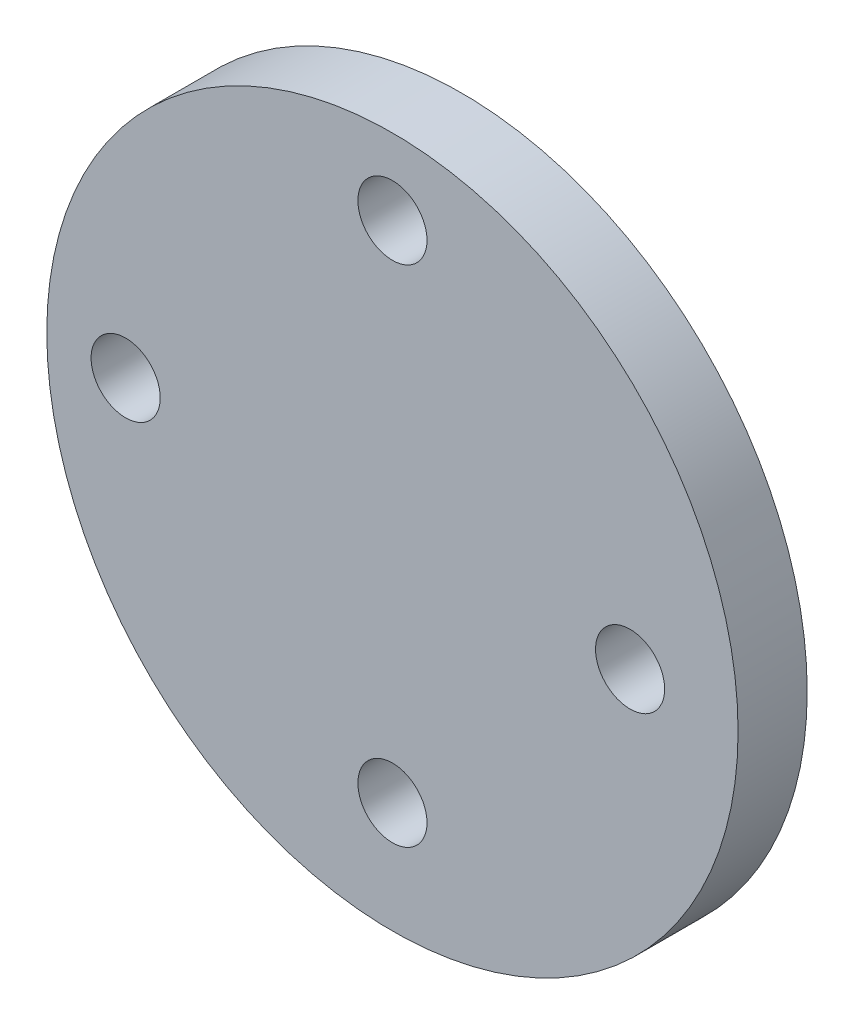
ISO-10303-21;
HEADER;
FILE_DESCRIPTION(('STEP AP214'),'2;1');
FILE_NAME('part.step','',(''),(''),'','','');
FILE_SCHEMA(('AUTOMOTIVE_DESIGN { 1 0 10303 214 1 1 1 1 }'));
ENDSEC;
DATA;
#1=APPLICATION_CONTEXT('core data for automotive mechanical design processes');
#2=APPLICATION_PROTOCOL_DEFINITION('international standard','automotive_design',2000,#1);
#3=PRODUCT_CONTEXT('',#1,'mechanical');
#4=PRODUCT('Part','Part','',(#3));
#5=PRODUCT_RELATED_PRODUCT_CATEGORY('part','',(#4));
#6=PRODUCT_DEFINITION_FORMATION('','',#4);
#7=PRODUCT_DEFINITION_CONTEXT('part definition',#1,'design');
#8=PRODUCT_DEFINITION('design','',#6,#7);
#9=PRODUCT_DEFINITION_SHAPE('','',#8);
#10=(LENGTH_UNIT() NAMED_UNIT(*) SI_UNIT(.MILLI.,.METRE.));
#11=(NAMED_UNIT(*) PLANE_ANGLE_UNIT() SI_UNIT($,.RADIAN.));
#12=(NAMED_UNIT(*) SI_UNIT($,.STERADIAN.) SOLID_ANGLE_UNIT());
#13=UNCERTAINTY_MEASURE_WITH_UNIT(LENGTH_MEASURE(1.E-05),#10,'distance_accuracy_value','');
#14=(GEOMETRIC_REPRESENTATION_CONTEXT(3) GLOBAL_UNCERTAINTY_ASSIGNED_CONTEXT((#13)) GLOBAL_UNIT_ASSIGNED_CONTEXT((#10,
#11,#12)) REPRESENTATION_CONTEXT('',''));
#15=CARTESIAN_POINT('',(0.,0.,0.));
#16=DIRECTION('',(0.,0.,1.));
#17=DIRECTION('',(1.,0.,0.));
#18=AXIS2_PLACEMENT_3D('',#15,#16,#17);
#19=CARTESIAN_POINT('',(0.,0.,10.));
#20=DIRECTION('',(0.,0.,1.));
#21=DIRECTION('',(1.,0.,0.));
#22=AXIS2_PLACEMENT_3D('',#19,#20,#21);
#23=PLANE('',#22);
#24=CARTESIAN_POINT('',(0.,-33.9403158779759,10.));
#25=DIRECTION('',(0.,0.,1.));
#26=DIRECTION('',(1.,0.,0.));
#27=AXIS2_PLACEMENT_3D('',#24,#25,#26);
#28=CIRCLE('',#27,5.);
#29=CARTESIAN_POINT('',(5.,-33.9403158779759,10.));
#30=VERTEX_POINT('',#29);
#31=EDGE_CURVE('E57',#30,#30,#28,.T.);
#32=ORIENTED_EDGE('',*,*,#31,.F.);
#33=EDGE_LOOP('',(#32));
#34=FACE_BOUND('',#33,.T.);
#35=CARTESIAN_POINT('',(0.,39.027729392876,10.));
#36=DIRECTION('',(0.,0.,1.));
#37=DIRECTION('',(1.,0.,0.));
#38=AXIS2_PLACEMENT_3D('',#35,#36,#37);
#39=CIRCLE('',#38,5.);
#40=CARTESIAN_POINT('',(5.,39.027729392876,10.));
#41=VERTEX_POINT('',#40);
#42=EDGE_CURVE('E46',#41,#41,#39,.T.);
#43=ORIENTED_EDGE('',*,*,#42,.F.);
#44=EDGE_LOOP('',(#43));
#45=FACE_BOUND('',#44,.T.);
#46=CARTESIAN_POINT('',(0.,0.,10.));
#47=DIRECTION('',(0.,0.,1.));
#48=DIRECTION('',(1.,0.,0.));
#49=AXIS2_PLACEMENT_3D('',#46,#47,#48);
#50=CIRCLE('',#49,50.);
#51=CARTESIAN_POINT('',(50.,0.,10.));
#52=VERTEX_POINT('',#51);
#53=EDGE_CURVE('E10',#52,#52,#50,.T.);
#54=ORIENTED_EDGE('',*,*,#53,.T.);
#55=EDGE_LOOP('',(#54));
#56=FACE_BOUND('',#55,.T.);
#57=CARTESIAN_POINT('',(-38.5916653773131,0.,10.));
#58=DIRECTION('',(0.,0.,1.));
#59=DIRECTION('',(1.,0.,0.));
#60=AXIS2_PLACEMENT_3D('',#57,#58,#59);
#61=CIRCLE('',#60,5.);
#62=CARTESIAN_POINT('',(-33.5916653773131,0.,10.));
#63=VERTEX_POINT('',#62);
#64=EDGE_CURVE('E51',#63,#63,#61,.T.);
#65=ORIENTED_EDGE('',*,*,#64,.F.);
#66=EDGE_LOOP('',(#65));
#67=FACE_BOUND('',#66,.T.);
#68=CARTESIAN_POINT('',(34.3763798935388,0.,10.));
#69=DIRECTION('',(0.,0.,1.));
#70=DIRECTION('',(1.,0.,0.));
#71=AXIS2_PLACEMENT_3D('',#68,#69,#70);
#72=CIRCLE('',#71,5.);
#73=CARTESIAN_POINT('',(39.3763798935388,0.,10.));
#74=VERTEX_POINT('',#73);
#75=EDGE_CURVE('E63',#74,#74,#72,.T.);
#76=ORIENTED_EDGE('',*,*,#75,.F.);
#77=EDGE_LOOP('',(#76));
#78=FACE_BOUND('',#77,.T.);
#79=ADVANCED_FACE('F35',(#34,#45,#56,#67,#78),#23,.T.);
#80=CARTESIAN_POINT('',(0.,0.,0.));
#81=DIRECTION('',(0.,0.,1.));
#82=DIRECTION('',(1.,0.,0.));
#83=AXIS2_PLACEMENT_3D('',#80,#81,#82);
#84=PLANE('',#83);
#85=CARTESIAN_POINT('',(0.,0.,0.));
#86=DIRECTION('',(0.,0.,1.));
#87=DIRECTION('',(1.,0.,0.));
#88=AXIS2_PLACEMENT_3D('',#85,#86,#87);
#89=CIRCLE('',#88,50.);
#90=CARTESIAN_POINT('',(50.,0.,0.));
#91=VERTEX_POINT('',#90);
#92=EDGE_CURVE('E39',#91,#91,#89,.T.);
#93=ORIENTED_EDGE('',*,*,#92,.F.);
#94=EDGE_LOOP('',(#93));
#95=FACE_BOUND('',#94,.T.);
#96=CARTESIAN_POINT('',(0.,39.027729392876,0.));
#97=DIRECTION('',(0.,0.,1.));
#98=DIRECTION('',(1.,0.,0.));
#99=AXIS2_PLACEMENT_3D('',#96,#97,#98);
#100=CIRCLE('',#99,5.);
#101=CARTESIAN_POINT('',(5.,39.027729392876,0.));
#102=VERTEX_POINT('',#101);
#103=EDGE_CURVE('E48',#102,#102,#100,.T.);
#104=ORIENTED_EDGE('',*,*,#103,.T.);
#105=EDGE_LOOP('',(#104));
#106=FACE_BOUND('',#105,.T.);
#107=CARTESIAN_POINT('',(-38.5916653773131,0.,0.));
#108=DIRECTION('',(0.,0.,1.));
#109=DIRECTION('',(1.,0.,0.));
#110=AXIS2_PLACEMENT_3D('',#107,#108,#109);
#111=CIRCLE('',#110,5.);
#112=CARTESIAN_POINT('',(-33.5916653773131,0.,0.));
#113=VERTEX_POINT('',#112);
#114=EDGE_CURVE('E54',#113,#113,#111,.T.);
#115=ORIENTED_EDGE('',*,*,#114,.T.);
#116=EDGE_LOOP('',(#115));
#117=FACE_BOUND('',#116,.T.);
#118=CARTESIAN_POINT('',(0.,-33.9403158779759,0.));
#119=DIRECTION('',(0.,0.,1.));
#120=DIRECTION('',(1.,0.,0.));
#121=AXIS2_PLACEMENT_3D('',#118,#119,#120);
#122=CIRCLE('',#121,5.);
#123=CARTESIAN_POINT('',(5.,-33.9403158779759,0.));
#124=VERTEX_POINT('',#123);
#125=EDGE_CURVE('E60',#124,#124,#122,.T.);
#126=ORIENTED_EDGE('',*,*,#125,.T.);
#127=EDGE_LOOP('',(#126));
#128=FACE_BOUND('',#127,.T.);
#129=CARTESIAN_POINT('',(34.3763798935388,0.,0.));
#130=DIRECTION('',(0.,0.,1.));
#131=DIRECTION('',(1.,0.,0.));
#132=AXIS2_PLACEMENT_3D('',#129,#130,#131);
#133=CIRCLE('',#132,5.);
#134=CARTESIAN_POINT('',(39.3763798935388,0.,0.));
#135=VERTEX_POINT('',#134);
#136=EDGE_CURVE('E66',#135,#135,#133,.T.);
#137=ORIENTED_EDGE('',*,*,#136,.T.);
#138=EDGE_LOOP('',(#137));
#139=FACE_BOUND('',#138,.T.);
#140=ADVANCED_FACE('F76',(#95,#106,#117,#128,#139),#84,.F.);
#141=CARTESIAN_POINT('',(0.,0.,10.));
#142=DIRECTION('',(0.,0.,-1.));
#143=DIRECTION('',(-1.,0.,0.));
#144=AXIS2_PLACEMENT_3D('',#141,#142,#143);
#145=CYLINDRICAL_SURFACE('',#144,50.);
#146=ORIENTED_EDGE('',*,*,#53,.F.);
#147=EDGE_LOOP('',(#146));
#148=FACE_BOUND('',#147,.T.);
#149=ORIENTED_EDGE('',*,*,#92,.T.);
#150=EDGE_LOOP('',(#149));
#151=FACE_BOUND('',#150,.T.);
#152=ADVANCED_FACE('F37',(#148,#151),#145,.T.);
#153=CARTESIAN_POINT('',(0.,39.027729392876,10.));
#154=DIRECTION('',(0.,0.,-1.));
#155=DIRECTION('',(-1.,0.,0.));
#156=AXIS2_PLACEMENT_3D('',#153,#154,#155);
#157=CYLINDRICAL_SURFACE('',#156,5.);
#158=ORIENTED_EDGE('',*,*,#42,.T.);
#159=EDGE_LOOP('',(#158));
#160=FACE_BOUND('',#159,.T.);
#161=ORIENTED_EDGE('',*,*,#103,.F.);
#162=EDGE_LOOP('',(#161));
#163=FACE_BOUND('',#162,.T.);
#164=ADVANCED_FACE('F86',(#160,#163),#157,.F.);
#165=CARTESIAN_POINT('',(-38.5916653773131,0.,10.));
#166=DIRECTION('',(0.,0.,-1.));
#167=DIRECTION('',(-1.,0.,0.));
#168=AXIS2_PLACEMENT_3D('',#165,#166,#167);
#169=CYLINDRICAL_SURFACE('',#168,5.);
#170=ORIENTED_EDGE('',*,*,#64,.T.);
#171=EDGE_LOOP('',(#170));
#172=FACE_BOUND('',#171,.T.);
#173=ORIENTED_EDGE('',*,*,#114,.F.);
#174=EDGE_LOOP('',(#173));
#175=FACE_BOUND('',#174,.T.);
#176=ADVANCED_FACE('F89',(#172,#175),#169,.F.);
#177=CARTESIAN_POINT('',(0.,-33.9403158779759,10.));
#178=DIRECTION('',(0.,0.,-1.));
#179=DIRECTION('',(-1.,0.,0.));
#180=AXIS2_PLACEMENT_3D('',#177,#178,#179);
#181=CYLINDRICAL_SURFACE('',#180,5.);
#182=ORIENTED_EDGE('',*,*,#31,.T.);
#183=EDGE_LOOP('',(#182));
#184=FACE_BOUND('',#183,.T.);
#185=ORIENTED_EDGE('',*,*,#125,.F.);
#186=EDGE_LOOP('',(#185));
#187=FACE_BOUND('',#186,.T.);
#188=ADVANCED_FACE('F93',(#184,#187),#181,.F.);
#189=CARTESIAN_POINT('',(34.3763798935388,0.,10.));
#190=DIRECTION('',(0.,0.,-1.));
#191=DIRECTION('',(-1.,0.,0.));
#192=AXIS2_PLACEMENT_3D('',#189,#190,#191);
#193=CYLINDRICAL_SURFACE('',#192,5.);
#194=ORIENTED_EDGE('',*,*,#75,.T.);
#195=EDGE_LOOP('',(#194));
#196=FACE_BOUND('',#195,.T.);
#197=ORIENTED_EDGE('',*,*,#136,.F.);
#198=EDGE_LOOP('',(#197));
#199=FACE_BOUND('',#198,.T.);
#200=ADVANCED_FACE('F72',(#196,#199),#193,.F.);
#201=CLOSED_SHELL('',(#79,#140,#152,#164,#176,#188,#200));
#202=MANIFOLD_SOLID_BREP('B2',#201);
#203=ADVANCED_BREP_SHAPE_REPRESENTATION('',(#18,#202),#14);
#204=SHAPE_DEFINITION_REPRESENTATION(#9,#203);
ENDSEC;
END-ISO-10303-21;
